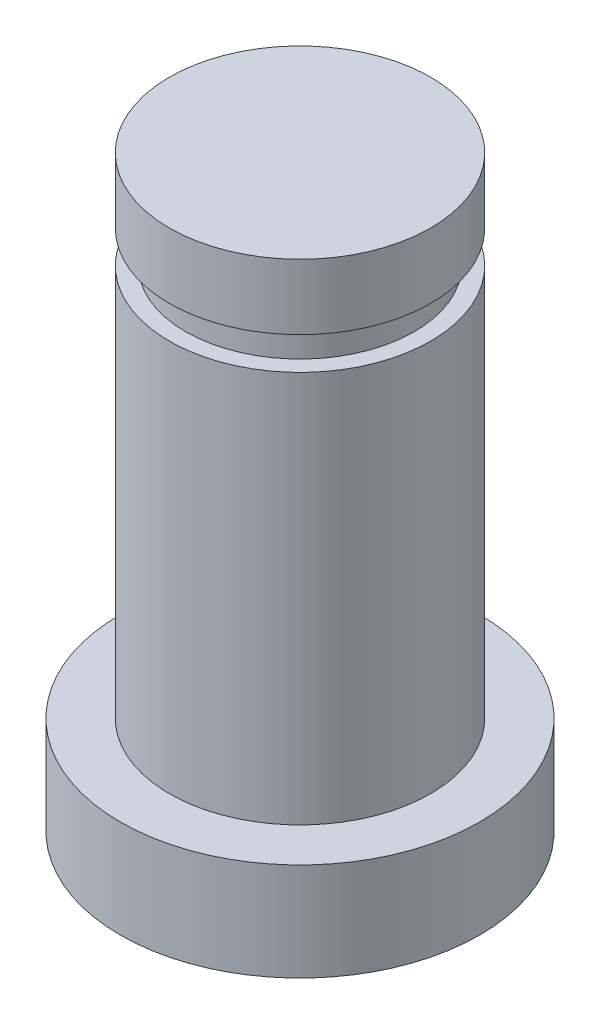
ISO-10303-21;
HEADER;
FILE_DESCRIPTION(('STEP AP214'),'2;1');
FILE_NAME('part.step','',(''),(''),'','','');
FILE_SCHEMA(('AUTOMOTIVE_DESIGN { 1 0 10303 214 1 1 1 1 }'));
ENDSEC;
DATA;
#1=APPLICATION_CONTEXT('core data for automotive mechanical design processes');
#2=APPLICATION_PROTOCOL_DEFINITION('international standard','automotive_design',2000,#1);
#3=PRODUCT_CONTEXT('',#1,'mechanical');
#4=PRODUCT('Part','Part','',(#3));
#5=PRODUCT_RELATED_PRODUCT_CATEGORY('part','',(#4));
#6=PRODUCT_DEFINITION_FORMATION('','',#4);
#7=PRODUCT_DEFINITION_CONTEXT('part definition',#1,'design');
#8=PRODUCT_DEFINITION('design','',#6,#7);
#9=PRODUCT_DEFINITION_SHAPE('','',#8);
#10=(LENGTH_UNIT() NAMED_UNIT(*) SI_UNIT(.MILLI.,.METRE.));
#11=(NAMED_UNIT(*) PLANE_ANGLE_UNIT() SI_UNIT($,.RADIAN.));
#12=(NAMED_UNIT(*) SI_UNIT($,.STERADIAN.) SOLID_ANGLE_UNIT());
#13=UNCERTAINTY_MEASURE_WITH_UNIT(LENGTH_MEASURE(1.E-05),#10,'distance_accuracy_value','');
#14=(GEOMETRIC_REPRESENTATION_CONTEXT(3) GLOBAL_UNCERTAINTY_ASSIGNED_CONTEXT((#13)) GLOBAL_UNIT_ASSIGNED_CONTEXT((#10,
#11,#12)) REPRESENTATION_CONTEXT('',''));
#15=CARTESIAN_POINT('',(0.,0.,0.));
#16=DIRECTION('',(0.,0.,1.));
#17=DIRECTION('',(1.,0.,0.));
#18=AXIS2_PLACEMENT_3D('',#15,#16,#17);
#19=CARTESIAN_POINT('',(0.,15.24,0.));
#20=DIRECTION('',(0.,-1.,0.));
#21=DIRECTION('',(0.,0.,-1.));
#22=AXIS2_PLACEMENT_3D('',#19,#20,#21);
#23=CYLINDRICAL_SURFACE('',#22,5.08);
#24=CARTESIAN_POINT('',(0.,15.24,0.));
#25=DIRECTION('',(0.,1.,0.));
#26=DIRECTION('',(0.,0.,1.));
#27=AXIS2_PLACEMENT_3D('',#24,#25,#26);
#28=CIRCLE('',#27,5.08);
#29=CARTESIAN_POINT('',(0.,15.24,-5.08));
#30=VERTEX_POINT('',#29);
#31=EDGE_CURVE('E51',#30,#30,#28,.T.);
#32=CARTESIAN_POINT('',(0.,0.,0.));
#33=DIRECTION('',(0.,1.,0.));
#34=DIRECTION('',(0.,0.,1.));
#35=AXIS2_PLACEMENT_3D('',#32,#33,#34);
#36=CIRCLE('',#35,5.08);
#37=CARTESIAN_POINT('',(0.,0.,-5.08));
#38=VERTEX_POINT('',#37);
#39=EDGE_CURVE('E46',#38,#38,#36,.T.);
#40=CARTESIAN_POINT('',(0.,15.24,-5.08));
#41=CARTESIAN_POINT('',(0.,15.08125,-5.08));
#42=CARTESIAN_POINT('',(0.,14.9225,-5.08));
#43=CARTESIAN_POINT('',(0.,14.605,-5.08));
#44=CARTESIAN_POINT('',(0.,14.44625,-5.08));
#45=CARTESIAN_POINT('',(0.,14.12875,-5.08));
#46=CARTESIAN_POINT('',(0.,13.97,-5.08));
#47=CARTESIAN_POINT('',(0.,13.6525,-5.08));
#48=CARTESIAN_POINT('',(0.,13.49375,-5.08));
#49=CARTESIAN_POINT('',(0.,13.17625,-5.08));
#50=CARTESIAN_POINT('',(0.,13.0175,-5.08));
#51=CARTESIAN_POINT('',(0.,12.7,-5.08));
#52=CARTESIAN_POINT('',(0.,12.54125,-5.08));
#53=CARTESIAN_POINT('',(0.,12.22375,-5.08));
#54=CARTESIAN_POINT('',(0.,12.065,-5.08));
#55=CARTESIAN_POINT('',(0.,11.7475,-5.08));
#56=CARTESIAN_POINT('',(0.,11.58875,-5.08));
#57=CARTESIAN_POINT('',(0.,11.27125,-5.08));
#58=CARTESIAN_POINT('',(0.,11.1125,-5.08));
#59=CARTESIAN_POINT('',(0.,10.795,-5.08));
#60=CARTESIAN_POINT('',(0.,10.63625,-5.08));
#61=CARTESIAN_POINT('',(0.,10.31875,-5.08));
#62=CARTESIAN_POINT('',(0.,10.16,-5.08));
#63=CARTESIAN_POINT('',(0.,9.8425,-5.08));
#64=CARTESIAN_POINT('',(0.,9.68375,-5.08));
#65=CARTESIAN_POINT('',(0.,9.36625,-5.08));
#66=CARTESIAN_POINT('',(0.,9.2075,-5.08));
#67=CARTESIAN_POINT('',(0.,8.89,-5.08));
#68=CARTESIAN_POINT('',(0.,8.73125,-5.08));
#69=CARTESIAN_POINT('',(0.,8.41375,-5.08));
#70=CARTESIAN_POINT('',(0.,8.255,-5.08));
#71=CARTESIAN_POINT('',(0.,7.9375,-5.08));
#72=CARTESIAN_POINT('',(0.,7.77875,-5.08));
#73=CARTESIAN_POINT('',(0.,7.46125,-5.08));
#74=CARTESIAN_POINT('',(0.,7.3025,-5.08));
#75=CARTESIAN_POINT('',(0.,6.985,-5.08));
#76=CARTESIAN_POINT('',(0.,6.82625,-5.08));
#77=CARTESIAN_POINT('',(0.,6.50875,-5.08));
#78=CARTESIAN_POINT('',(0.,6.35,-5.08));
#79=CARTESIAN_POINT('',(0.,6.0325,-5.08));
#80=CARTESIAN_POINT('',(0.,5.87375,-5.08));
#81=CARTESIAN_POINT('',(0.,5.55625,-5.08));
#82=CARTESIAN_POINT('',(0.,5.3975,-5.08));
#83=CARTESIAN_POINT('',(0.,5.08,-5.08));
#84=CARTESIAN_POINT('',(0.,4.92125,-5.08));
#85=CARTESIAN_POINT('',(0.,4.60375,-5.08));
#86=CARTESIAN_POINT('',(0.,4.445,-5.08));
#87=CARTESIAN_POINT('',(0.,4.1275,-5.08));
#88=CARTESIAN_POINT('',(0.,3.96875,-5.08));
#89=CARTESIAN_POINT('',(0.,3.65125,-5.08));
#90=CARTESIAN_POINT('',(0.,3.4925,-5.08));
#91=CARTESIAN_POINT('',(0.,3.175,-5.08));
#92=CARTESIAN_POINT('',(0.,3.01625,-5.08));
#93=CARTESIAN_POINT('',(0.,2.69875,-5.08));
#94=CARTESIAN_POINT('',(0.,2.54,-5.08));
#95=CARTESIAN_POINT('',(0.,2.2225,-5.08));
#96=CARTESIAN_POINT('',(0.,2.06375,-5.08));
#97=CARTESIAN_POINT('',(0.,1.74625,-5.08));
#98=CARTESIAN_POINT('',(0.,1.5875,-5.08));
#99=CARTESIAN_POINT('',(0.,1.27,-5.08));
#100=CARTESIAN_POINT('',(0.,1.11125,-5.08));
#101=CARTESIAN_POINT('',(0.,0.79375,-5.08));
#102=CARTESIAN_POINT('',(0.,0.634999999999999,-5.08));
#103=CARTESIAN_POINT('',(0.,0.3175,-5.08));
#104=CARTESIAN_POINT('',(0.,0.15875,-5.08));
#105=CARTESIAN_POINT('',(0.,0.,-5.08));
#106=B_SPLINE_CURVE_WITH_KNOTS('',3,(#40,#41,#42,#43,#44,#45,#46,#47,#48,#49,#50,#51,#52,#53,
#54,#55,#56,#57,#58,#59,#60,#61,#62,#63,#64,#65,#66,#67,#68,#69,#70,#71,#72,#73,#74,#75,#76,#77,
#78,#79,#80,#81,#82,#83,#84,#85,#86,#87,#88,#89,#90,#91,#92,#93,#94,#95,#96,#97,#98,#99,#100,
#101,#102,#103,#104,#105),.UNSPECIFIED.,.F.,.F.,(4,2,2,2,2,2,2,2,2,2,2,2,2,2,2,2,2,2,2,2,2,2,2,
2,2,2,2,2,2,2,2,2,4),(0.,0.476250000000001,0.9525,1.42875,1.905,2.38125,2.8575,3.33375,3.81,
4.28625,4.7625,5.23875,5.715,6.19125,6.6675,7.14375,7.62,8.09625,8.5725,9.04875,9.525,10.00125,
10.4775,10.95375,11.43,11.90625,12.3825,12.85875,13.335,13.81125,14.2875,14.76375,15.24),.UNSPECIFIED.);
#107=EDGE_CURVE('BSEAM43',#30,#38,#106,.T.);
#108=ORIENTED_EDGE('',*,*,#31,.F.);
#109=ORIENTED_EDGE('',*,*,#39,.T.);
#110=ORIENTED_EDGE('',*,*,#107,.T.);
#111=ORIENTED_EDGE('',*,*,#107,.F.);
#112=EDGE_LOOP('',(#108,#110,#109,#111));
#113=FACE_BOUND('',#112,.T.);
#114=ADVANCED_FACE('F43',(#113),#23,.T.);
#115=CARTESIAN_POINT('',(0.,15.24,0.));
#116=DIRECTION('',(0.,1.,0.));
#117=DIRECTION('',(0.,0.,1.));
#118=AXIS2_PLACEMENT_3D('',#115,#116,#117);
#119=PLANE('',#118);
#120=CARTESIAN_POINT('',(0.,15.24,0.));
#121=DIRECTION('',(0.,1.,0.));
#122=DIRECTION('',(0.,0.,1.));
#123=AXIS2_PLACEMENT_3D('',#120,#121,#122);
#124=CIRCLE('',#123,4.445);
#125=CARTESIAN_POINT('',(0.,15.24,4.445));
#126=VERTEX_POINT('',#125);
#127=EDGE_CURVE('E10',#126,#126,#124,.T.);
#128=ORIENTED_EDGE('',*,*,#127,.F.);
#129=EDGE_LOOP('',(#128));
#130=FACE_BOUND('',#129,.T.);
#131=ORIENTED_EDGE('',*,*,#31,.T.);
#132=EDGE_LOOP('',(#131));
#133=FACE_BOUND('',#132,.T.);
#134=ADVANCED_FACE('F106',(#130,#133),#119,.T.);
#135=CARTESIAN_POINT('',(0.,16.51,0.));
#136=DIRECTION('',(0.,-1.,0.));
#137=DIRECTION('',(0.,0.,-1.));
#138=AXIS2_PLACEMENT_3D('',#135,#136,#137);
#139=CYLINDRICAL_SURFACE('',#138,4.445);
#140=CARTESIAN_POINT('',(0.,16.51,0.));
#141=DIRECTION('',(0.,1.,0.));
#142=DIRECTION('',(0.,0.,1.));
#143=AXIS2_PLACEMENT_3D('',#140,#141,#142);
#144=CIRCLE('',#143,4.445);
#145=CARTESIAN_POINT('',(0.,16.51,4.445));
#146=VERTEX_POINT('',#145);
#147=EDGE_CURVE('E57',#146,#146,#144,.T.);
#148=ORIENTED_EDGE('',*,*,#147,.F.);
#149=EDGE_LOOP('',(#148));
#150=FACE_BOUND('',#149,.T.);
#151=ORIENTED_EDGE('',*,*,#127,.T.);
#152=EDGE_LOOP('',(#151));
#153=FACE_BOUND('',#152,.T.);
#154=ADVANCED_FACE('F111',(#150,#153),#139,.T.);
#155=CARTESIAN_POINT('',(0.,19.05,0.));
#156=DIRECTION('',(0.,-1.,0.));
#157=DIRECTION('',(0.,0.,-1.));
#158=AXIS2_PLACEMENT_3D('',#155,#156,#157);
#159=CYLINDRICAL_SURFACE('',#158,5.08);
#160=CARTESIAN_POINT('',(0.,19.05,0.));
#161=DIRECTION('',(0.,1.,0.));
#162=DIRECTION('',(0.,0.,1.));
#163=AXIS2_PLACEMENT_3D('',#160,#161,#162);
#164=CIRCLE('',#163,5.08);
#165=CARTESIAN_POINT('',(0.,19.05,5.08));
#166=VERTEX_POINT('',#165);
#167=EDGE_CURVE('E62',#166,#166,#164,.T.);
#168=ORIENTED_EDGE('',*,*,#167,.F.);
#169=EDGE_LOOP('',(#168));
#170=FACE_BOUND('',#169,.T.);
#171=CARTESIAN_POINT('',(0.,16.51,0.));
#172=DIRECTION('',(0.,1.,0.));
#173=DIRECTION('',(0.,0.,1.));
#174=AXIS2_PLACEMENT_3D('',#171,#172,#173);
#175=CIRCLE('',#174,5.08);
#176=CARTESIAN_POINT('',(0.,16.51,5.08));
#177=VERTEX_POINT('',#176);
#178=EDGE_CURVE('E63',#177,#177,#175,.T.);
#179=ORIENTED_EDGE('',*,*,#178,.T.);
#180=EDGE_LOOP('',(#179));
#181=FACE_BOUND('',#180,.T.);
#182=ADVANCED_FACE('F118',(#170,#181),#159,.T.);
#183=CARTESIAN_POINT('',(0.,19.05,0.));
#184=DIRECTION('',(0.,1.,0.));
#185=DIRECTION('',(0.,0.,1.));
#186=AXIS2_PLACEMENT_3D('',#183,#184,#185);
#187=PLANE('',#186);
#188=ORIENTED_EDGE('',*,*,#167,.T.);
#189=EDGE_LOOP('',(#188));
#190=FACE_BOUND('',#189,.T.);
#191=ADVANCED_FACE('F101',(#190),#187,.T.);
#192=CARTESIAN_POINT('',(0.,16.51,0.));
#193=DIRECTION('',(0.,1.,0.));
#194=DIRECTION('',(0.,0.,1.));
#195=AXIS2_PLACEMENT_3D('',#192,#193,#194);
#196=PLANE('',#195);
#197=ORIENTED_EDGE('',*,*,#147,.T.);
#198=EDGE_LOOP('',(#197));
#199=FACE_BOUND('',#198,.T.);
#200=ORIENTED_EDGE('',*,*,#178,.F.);
#201=EDGE_LOOP('',(#200));
#202=FACE_BOUND('',#201,.T.);
#203=ADVANCED_FACE('F93',(#199,#202),#196,.F.);
#204=CARTESIAN_POINT('',(0.,-3.81,0.));
#205=DIRECTION('',(0.,1.,0.));
#206=DIRECTION('',(0.,0.,1.));
#207=AXIS2_PLACEMENT_3D('',#204,#205,#206);
#208=CYLINDRICAL_SURFACE('',#207,6.985);
#209=CARTESIAN_POINT('',(0.,-3.81,0.));
#210=DIRECTION('',(0.,-1.,0.));
#211=DIRECTION('',(0.,0.,-1.));
#212=AXIS2_PLACEMENT_3D('',#209,#210,#211);
#213=CIRCLE('',#212,6.985);
#214=CARTESIAN_POINT('',(0.,-3.81,6.985));
#215=VERTEX_POINT('',#214);
#216=EDGE_CURVE('E74',#215,#215,#213,.T.);
#217=CARTESIAN_POINT('',(0.,0.,0.));
#218=DIRECTION('',(0.,-1.,0.));
#219=DIRECTION('',(0.,0.,-1.));
#220=AXIS2_PLACEMENT_3D('',#217,#218,#219);
#221=CIRCLE('',#220,6.985);
#222=CARTESIAN_POINT('',(0.,0.,6.985));
#223=VERTEX_POINT('',#222);
#224=EDGE_CURVE('E70',#223,#223,#221,.T.);
#225=CARTESIAN_POINT('',(0.,-3.81,6.985));
#226=CARTESIAN_POINT('',(0.,-3.7703125,6.985));
#227=CARTESIAN_POINT('',(0.,-3.730625,6.985));
#228=CARTESIAN_POINT('',(0.,-3.65125,6.985));
#229=CARTESIAN_POINT('',(0.,-3.6115625,6.985));
#230=CARTESIAN_POINT('',(0.,-3.5321875,6.985));
#231=CARTESIAN_POINT('',(0.,-3.4925,6.985));
#232=CARTESIAN_POINT('',(0.,-3.413125,6.985));
#233=CARTESIAN_POINT('',(0.,-3.3734375,6.985));
#234=CARTESIAN_POINT('',(0.,-3.2940625,6.985));
#235=CARTESIAN_POINT('',(0.,-3.254375,6.985));
#236=CARTESIAN_POINT('',(0.,-3.175,6.985));
#237=CARTESIAN_POINT('',(0.,-3.1353125,6.985));
#238=CARTESIAN_POINT('',(0.,-3.0559375,6.985));
#239=CARTESIAN_POINT('',(0.,-3.01625,6.985));
#240=CARTESIAN_POINT('',(0.,-2.936875,6.985));
#241=CARTESIAN_POINT('',(0.,-2.8971875,6.985));
#242=CARTESIAN_POINT('',(0.,-2.8178125,6.985));
#243=CARTESIAN_POINT('',(0.,-2.778125,6.985));
#244=CARTESIAN_POINT('',(0.,-2.69875,6.985));
#245=CARTESIAN_POINT('',(0.,-2.6590625,6.985));
#246=CARTESIAN_POINT('',(0.,-2.5796875,6.985));
#247=CARTESIAN_POINT('',(0.,-2.54,6.985));
#248=CARTESIAN_POINT('',(0.,-2.460625,6.985));
#249=CARTESIAN_POINT('',(0.,-2.4209375,6.985));
#250=CARTESIAN_POINT('',(0.,-2.3415625,6.985));
#251=CARTESIAN_POINT('',(0.,-2.301875,6.985));
#252=CARTESIAN_POINT('',(0.,-2.2225,6.985));
#253=CARTESIAN_POINT('',(0.,-2.1828125,6.985));
#254=CARTESIAN_POINT('',(0.,-2.1034375,6.985));
#255=CARTESIAN_POINT('',(0.,-2.06375,6.985));
#256=CARTESIAN_POINT('',(0.,-1.984375,6.985));
#257=CARTESIAN_POINT('',(0.,-1.9446875,6.985));
#258=CARTESIAN_POINT('',(0.,-1.8653125,6.985));
#259=CARTESIAN_POINT('',(0.,-1.825625,6.985));
#260=CARTESIAN_POINT('',(0.,-1.74625,6.985));
#261=CARTESIAN_POINT('',(0.,-1.7065625,6.985));
#262=CARTESIAN_POINT('',(0.,-1.6271875,6.985));
#263=CARTESIAN_POINT('',(0.,-1.5875,6.985));
#264=CARTESIAN_POINT('',(0.,-1.508125,6.985));
#265=CARTESIAN_POINT('',(0.,-1.4684375,6.985));
#266=CARTESIAN_POINT('',(0.,-1.3890625,6.985));
#267=CARTESIAN_POINT('',(0.,-1.349375,6.985));
#268=CARTESIAN_POINT('',(0.,-1.27,6.985));
#269=CARTESIAN_POINT('',(0.,-1.2303125,6.985));
#270=CARTESIAN_POINT('',(0.,-1.1509375,6.985));
#271=CARTESIAN_POINT('',(0.,-1.11125,6.985));
#272=CARTESIAN_POINT('',(0.,-1.031875,6.985));
#273=CARTESIAN_POINT('',(0.,-0.9921875,6.985));
#274=CARTESIAN_POINT('',(0.,-0.9128125,6.985));
#275=CARTESIAN_POINT('',(0.,-0.873125,6.985));
#276=CARTESIAN_POINT('',(0.,-0.79375,6.985));
#277=CARTESIAN_POINT('',(0.,-0.7540625,6.985));
#278=CARTESIAN_POINT('',(0.,-0.6746875,6.985));
#279=CARTESIAN_POINT('',(0.,-0.635,6.985));
#280=CARTESIAN_POINT('',(0.,-0.555625,6.985));
#281=CARTESIAN_POINT('',(0.,-0.5159375,6.985));
#282=CARTESIAN_POINT('',(0.,-0.4365625,6.985));
#283=CARTESIAN_POINT('',(0.,-0.396875,6.985));
#284=CARTESIAN_POINT('',(0.,-0.3175,6.985));
#285=CARTESIAN_POINT('',(0.,-0.2778125,6.985));
#286=CARTESIAN_POINT('',(0.,-0.1984375,6.985));
#287=CARTESIAN_POINT('',(0.,-0.15875,6.985));
#288=CARTESIAN_POINT('',(0.,-0.0793749999999999,6.985));
#289=CARTESIAN_POINT('',(0.,-0.0396874999999999,6.985));
#290=CARTESIAN_POINT('',(0.,0.,6.985));
#291=B_SPLINE_CURVE_WITH_KNOTS('',3,(#225,#226,#227,#228,#229,#230,#231,#232,#233,#234,#235,
#236,#237,#238,#239,#240,#241,#242,#243,#244,#245,#246,#247,#248,#249,#250,#251,#252,#253,#254,
#255,#256,#257,#258,#259,#260,#261,#262,#263,#264,#265,#266,#267,#268,#269,#270,#271,#272,#273,
#274,#275,#276,#277,#278,#279,#280,#281,#282,#283,#284,#285,#286,#287,#288,#289,#290),
.UNSPECIFIED.,.F.,.F.,(4,2,2,2,2,2,2,2,2,2,2,2,2,2,2,2,2,2,2,2,2,2,2,2,2,2,2,2,2,2,2,2,4),(0.,
0.1190625,0.238125,0.3571875,0.47625,0.595312499999999,0.714375,0.833437499999999,
0.952499999999999,1.0715625,1.190625,1.3096875,1.42875,1.5478125,1.666875,1.7859375,1.905,
2.0240625,2.143125,2.2621875,2.38125,2.5003125,2.619375,2.7384375,2.8575,2.9765625,3.095625,
3.2146875,3.33375,3.4528125,3.571875,3.6909375,3.81),.UNSPECIFIED.);
#292=EDGE_CURVE('BSEAM91',#215,#223,#291,.T.);
#293=ORIENTED_EDGE('',*,*,#216,.F.);
#294=ORIENTED_EDGE('',*,*,#224,.T.);
#295=ORIENTED_EDGE('',*,*,#292,.T.);
#296=ORIENTED_EDGE('',*,*,#292,.F.);
#297=EDGE_LOOP('',(#293,#295,#294,#296));
#298=FACE_BOUND('',#297,.T.);
#299=ADVANCED_FACE('F91',(#298),#208,.T.);
#300=CARTESIAN_POINT('',(0.,-3.81,0.));
#301=DIRECTION('',(0.,-1.,0.));
#302=DIRECTION('',(0.,0.,-1.));
#303=AXIS2_PLACEMENT_3D('',#300,#301,#302);
#304=PLANE('',#303);
#305=ORIENTED_EDGE('',*,*,#216,.T.);
#306=EDGE_LOOP('',(#305));
#307=FACE_BOUND('',#306,.T.);
#308=ADVANCED_FACE('F87',(#307),#304,.T.);
#309=CARTESIAN_POINT('',(0.,0.,0.));
#310=DIRECTION('',(0.,-1.,0.));
#311=DIRECTION('',(0.,0.,-1.));
#312=AXIS2_PLACEMENT_3D('',#309,#310,#311);
#313=PLANE('',#312);
#314=ORIENTED_EDGE('',*,*,#39,.F.);
#315=EDGE_LOOP('',(#314));
#316=FACE_BOUND('',#315,.T.);
#317=ORIENTED_EDGE('',*,*,#224,.F.);
#318=EDGE_LOOP('',(#317));
#319=FACE_BOUND('',#318,.T.);
#320=ADVANCED_FACE('F84',(#316,#319),#313,.F.);
#321=CLOSED_SHELL('',(#114,#134,#154,#182,#191,#203,#299,#308,#320));
#322=MANIFOLD_SOLID_BREP('B2',#321);
#323=ADVANCED_BREP_SHAPE_REPRESENTATION('',(#18,#322),#14);
#324=SHAPE_DEFINITION_REPRESENTATION(#9,#323);
ENDSEC;
END-ISO-10303-21;
